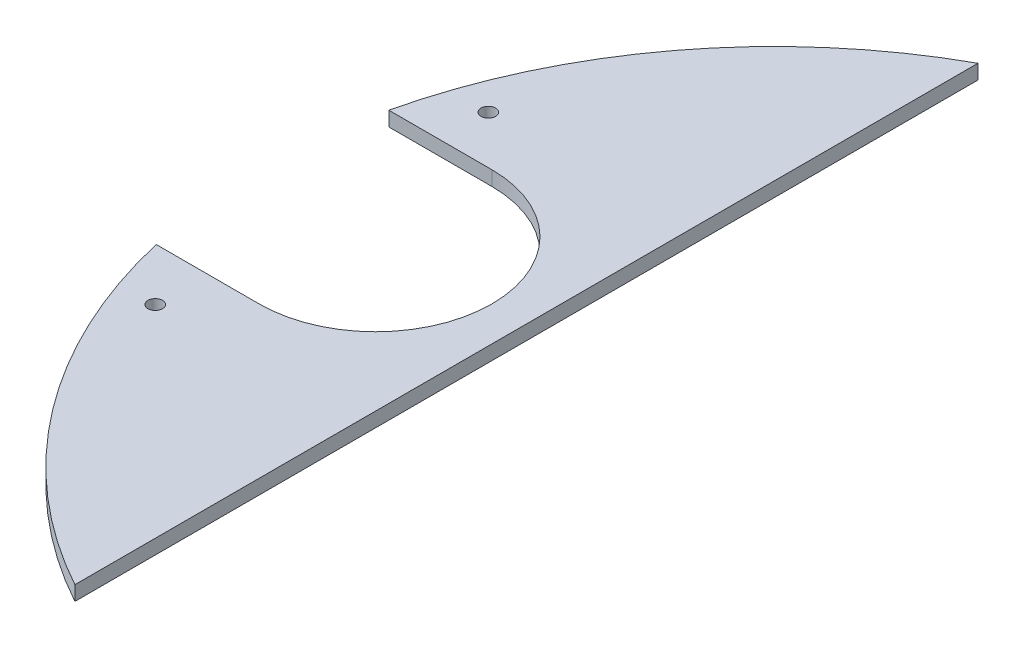
ISO-10303-21;
HEADER;
FILE_DESCRIPTION(('STEP AP214'),'2;1');
FILE_NAME('part.step','',(''),(''),'','','');
FILE_SCHEMA(('AUTOMOTIVE_DESIGN { 1 0 10303 214 1 1 1 1 }'));
ENDSEC;
DATA;
#1=APPLICATION_CONTEXT('core data for automotive mechanical design processes');
#2=APPLICATION_PROTOCOL_DEFINITION('international standard','automotive_design',2000,#1);
#3=PRODUCT_CONTEXT('',#1,'mechanical');
#4=PRODUCT('Part','Part','',(#3));
#5=PRODUCT_RELATED_PRODUCT_CATEGORY('part','',(#4));
#6=PRODUCT_DEFINITION_FORMATION('','',#4);
#7=PRODUCT_DEFINITION_CONTEXT('part definition',#1,'design');
#8=PRODUCT_DEFINITION('design','',#6,#7);
#9=PRODUCT_DEFINITION_SHAPE('','',#8);
#10=(LENGTH_UNIT() NAMED_UNIT(*) SI_UNIT(.MILLI.,.METRE.));
#11=(NAMED_UNIT(*) PLANE_ANGLE_UNIT() SI_UNIT($,.RADIAN.));
#12=(NAMED_UNIT(*) SI_UNIT($,.STERADIAN.) SOLID_ANGLE_UNIT());
#13=UNCERTAINTY_MEASURE_WITH_UNIT(LENGTH_MEASURE(1.E-05),#10,'distance_accuracy_value','');
#14=(GEOMETRIC_REPRESENTATION_CONTEXT(3) GLOBAL_UNCERTAINTY_ASSIGNED_CONTEXT((#13)) GLOBAL_UNIT_ASSIGNED_CONTEXT((#10,
#11,#12)) REPRESENTATION_CONTEXT('',''));
#15=CARTESIAN_POINT('',(0.,0.,0.));
#16=DIRECTION('',(0.,0.,1.));
#17=DIRECTION('',(1.,0.,0.));
#18=AXIS2_PLACEMENT_3D('',#15,#16,#17);
#19=CARTESIAN_POINT('',(-80.,-3.175,0.));
#20=DIRECTION('',(0.,1.,0.));
#21=DIRECTION('',(0.,0.,1.));
#22=AXIS2_PLACEMENT_3D('',#19,#20,#21);
#23=CYLINDRICAL_SURFACE('',#22,112.5);
#24=DIRECTION('',(0.,1.,0.));
#25=VECTOR('',#24,1.);
#26=CARTESIAN_POINT('',(-134.136468804172,-3.175,98.617912903361));
#27=LINE('',#26,#25);
#28=CARTESIAN_POINT('',(-134.136468804172,0.,98.617912903361));
#29=VERTEX_POINT('',#28);
#30=CARTESIAN_POINT('',(-134.136468804172,-3.175,98.617912903361));
#31=VERTEX_POINT('',#30);
#32=EDGE_CURVE('E86',#29,#31,#27,.F.);
#33=ORIENTED_EDGE('',*,*,#32,.F.);
#34=CARTESIAN_POINT('',(-80.,0.,0.));
#35=DIRECTION('',(0.,1.,0.));
#36=DIRECTION('',(0.,0.,1.));
#37=AXIS2_PLACEMENT_3D('',#34,#35,#36);
#38=CIRCLE('',#37,112.5);
#39=CARTESIAN_POINT('',(-189.59511850443,0.,25.4));
#40=VERTEX_POINT('',#39);
#41=EDGE_CURVE('E98',#40,#29,#38,.T.);
#42=ORIENTED_EDGE('',*,*,#41,.F.);
#43=DIRECTION('',(0.,1.,0.));
#44=VECTOR('',#43,1.);
#45=CARTESIAN_POINT('',(-189.59511850443,-3.175,25.4));
#46=LINE('',#45,#44);
#47=CARTESIAN_POINT('',(-189.59511850443,-3.175,25.4));
#48=VERTEX_POINT('',#47);
#49=EDGE_CURVE('E105',#48,#40,#46,.T.);
#50=ORIENTED_EDGE('',*,*,#49,.F.);
#51=CARTESIAN_POINT('',(-80.,-3.175,0.));
#52=DIRECTION('',(0.,1.,0.));
#53=DIRECTION('',(0.,0.,1.));
#54=AXIS2_PLACEMENT_3D('',#51,#52,#53);
#55=CIRCLE('',#54,112.5);
#56=EDGE_CURVE('E100',#48,#31,#55,.T.);
#57=ORIENTED_EDGE('',*,*,#56,.T.);
#58=EDGE_LOOP('',(#33,#42,#50,#57));
#59=FACE_BOUND('',#58,.T.);
#60=ADVANCED_FACE('F33',(#59),#23,.T.);
#61=DIRECTION('',(0.,1.,0.));
#62=VECTOR('',#61,1.);
#63=CARTESIAN_POINT('',(-134.136468804172,-3.175,-98.617912903361));
#64=LINE('',#63,#62);
#65=CARTESIAN_POINT('',(-134.136468804172,-3.175,-98.617912903361));
#66=VERTEX_POINT('',#65);
#67=CARTESIAN_POINT('',(-134.136468804172,0.,-98.617912903361));
#68=VERTEX_POINT('',#67);
#69=EDGE_CURVE('E48',#66,#68,#64,.T.);
#70=ORIENTED_EDGE('',*,*,#69,.F.);
#71=CARTESIAN_POINT('',(-189.59511850443,-3.175,-25.4));
#72=VERTEX_POINT('',#71);
#73=EDGE_CURVE('E41',#66,#72,#55,.T.);
#74=ORIENTED_EDGE('',*,*,#73,.T.);
#75=DIRECTION('',(0.,1.,0.));
#76=VECTOR('',#75,1.);
#77=CARTESIAN_POINT('',(-189.59511850443,-3.175,-25.4));
#78=LINE('',#77,#76);
#79=CARTESIAN_POINT('',(-189.59511850443,0.,-25.4));
#80=VERTEX_POINT('',#79);
#81=EDGE_CURVE('E106',#80,#72,#78,.F.);
#82=ORIENTED_EDGE('',*,*,#81,.F.);
#83=EDGE_CURVE('E104',#68,#80,#38,.T.);
#84=ORIENTED_EDGE('',*,*,#83,.F.);
#85=EDGE_LOOP('',(#70,#74,#82,#84));
#86=FACE_BOUND('',#85,.T.);
#87=ADVANCED_FACE('F35',(#86),#23,.T.);
#88=CARTESIAN_POINT('',(-80.,-3.175,0.));
#89=DIRECTION('',(0.,1.,0.));
#90=DIRECTION('',(0.,0.,1.));
#91=AXIS2_PLACEMENT_3D('',#88,#89,#90);
#92=PLANE('',#91);
#93=CARTESIAN_POINT('',(-178.345859252215,-3.175,-35.8858641471329));
#94=DIRECTION('',(0.,1.,0.));
#95=DIRECTION('',(0.,0.,1.));
#96=AXIS2_PLACEMENT_3D('',#93,#94,#95);
#97=CIRCLE('',#96,1.58749999999999);
#98=CARTESIAN_POINT('',(-178.345859252215,-3.175,-34.2983641471329));
#99=VERTEX_POINT('',#98);
#100=EDGE_CURVE('E134',#99,#99,#97,.T.);
#101=ORIENTED_EDGE('',*,*,#100,.T.);
#102=EDGE_LOOP('',(#101));
#103=FACE_BOUND('',#102,.T.);
#104=CARTESIAN_POINT('',(-178.345859252215,-3.175,36.8647455686073));
#105=DIRECTION('',(0.,1.,0.));
#106=DIRECTION('',(0.,0.,1.));
#107=AXIS2_PLACEMENT_3D('',#104,#105,#106);
#108=CIRCLE('',#107,1.58749999999999);
#109=CARTESIAN_POINT('',(-178.345859252215,-3.175,38.4522455686073));
#110=VERTEX_POINT('',#109);
#111=EDGE_CURVE('E92',#110,#110,#108,.T.);
#112=ORIENTED_EDGE('',*,*,#111,.T.);
#113=EDGE_LOOP('',(#112));
#114=FACE_BOUND('',#113,.T.);
#115=ORIENTED_EDGE('',*,*,#73,.F.);
#116=DIRECTION('',(0.,0.,1.));
#117=VECTOR('',#116,1.);
#118=CARTESIAN_POINT('',(-134.136468804172,-3.175,-167.182890918639));
#119=LINE('',#118,#117);
#120=EDGE_CURVE('E91',#66,#31,#119,.T.);
#121=ORIENTED_EDGE('',*,*,#120,.T.);
#122=ORIENTED_EDGE('',*,*,#56,.F.);
#123=DIRECTION('',(1.,0.,0.));
#124=VECTOR('',#123,1.);
#125=CARTESIAN_POINT('',(-229.776686607569,-3.175,25.4));
#126=LINE('',#125,#124);
#127=CARTESIAN_POINT('',(-167.0966,-3.175,25.4));
#128=VERTEX_POINT('',#127);
#129=EDGE_CURVE('E115',#48,#128,#126,.T.);
#130=ORIENTED_EDGE('',*,*,#129,.T.);
#131=CARTESIAN_POINT('',(-167.0966,-3.175,0.));
#132=DIRECTION('',(0.,1.,0.));
#133=DIRECTION('',(0.,0.,-1.));
#134=AXIS2_PLACEMENT_3D('',#131,#132,#133);
#135=CIRCLE('',#134,25.4);
#136=CARTESIAN_POINT('',(-167.0966,-3.175,-25.4));
#137=VERTEX_POINT('',#136);
#138=EDGE_CURVE('E120',#128,#137,#135,.T.);
#139=ORIENTED_EDGE('',*,*,#138,.T.);
#140=DIRECTION('',(-1.,0.,0.));
#141=VECTOR('',#140,1.);
#142=CARTESIAN_POINT('',(-167.0966,-3.175,-25.4));
#143=LINE('',#142,#141);
#144=EDGE_CURVE('E124',#137,#72,#143,.T.);
#145=ORIENTED_EDGE('',*,*,#144,.T.);
#146=EDGE_LOOP('',(#115,#121,#122,#130,#139,#145));
#147=FACE_BOUND('',#146,.T.);
#148=ADVANCED_FACE('F143',(#103,#114,#147),#92,.F.);
#149=CARTESIAN_POINT('',(-80.,0.,0.));
#150=DIRECTION('',(0.,1.,0.));
#151=DIRECTION('',(0.,0.,1.));
#152=AXIS2_PLACEMENT_3D('',#149,#150,#151);
#153=PLANE('',#152);
#154=CARTESIAN_POINT('',(-178.345859252215,0.,-35.8858641471329));
#155=DIRECTION('',(0.,1.,0.));
#156=DIRECTION('',(0.,0.,1.));
#157=AXIS2_PLACEMENT_3D('',#154,#155,#156);
#158=CIRCLE('',#157,1.58749999999999);
#159=CARTESIAN_POINT('',(-178.345859252215,0.,-34.2983641471329));
#160=VERTEX_POINT('',#159);
#161=EDGE_CURVE('E137',#160,#160,#158,.T.);
#162=ORIENTED_EDGE('',*,*,#161,.F.);
#163=EDGE_LOOP('',(#162));
#164=FACE_BOUND('',#163,.T.);
#165=CARTESIAN_POINT('',(-178.345859252215,0.,36.8647455686073));
#166=DIRECTION('',(0.,1.,0.));
#167=DIRECTION('',(0.,0.,1.));
#168=AXIS2_PLACEMENT_3D('',#165,#166,#167);
#169=CIRCLE('',#168,1.58749999999999);
#170=CARTESIAN_POINT('',(-178.345859252215,0.,38.4522455686073));
#171=VERTEX_POINT('',#170);
#172=EDGE_CURVE('E131',#171,#171,#169,.T.);
#173=ORIENTED_EDGE('',*,*,#172,.F.);
#174=EDGE_LOOP('',(#173));
#175=FACE_BOUND('',#174,.T.);
#176=DIRECTION('',(0.,0.,1.));
#177=VECTOR('',#176,1.);
#178=CARTESIAN_POINT('',(-134.136468804172,0.,-167.182890918639));
#179=LINE('',#178,#177);
#180=EDGE_CURVE('E83',#68,#29,#179,.T.);
#181=ORIENTED_EDGE('',*,*,#180,.F.);
#182=ORIENTED_EDGE('',*,*,#83,.T.);
#183=DIRECTION('',(-1.,0.,0.));
#184=VECTOR('',#183,1.);
#185=CARTESIAN_POINT('',(-167.0966,0.,-25.4));
#186=LINE('',#185,#184);
#187=CARTESIAN_POINT('',(-167.0966,0.,-25.4));
#188=VERTEX_POINT('',#187);
#189=EDGE_CURVE('E117',#188,#80,#186,.T.);
#190=ORIENTED_EDGE('',*,*,#189,.F.);
#191=CARTESIAN_POINT('',(-167.0966,0.,0.));
#192=DIRECTION('',(0.,1.,0.));
#193=DIRECTION('',(0.,0.,-1.));
#194=AXIS2_PLACEMENT_3D('',#191,#192,#193);
#195=CIRCLE('',#194,25.4);
#196=CARTESIAN_POINT('',(-167.0966,0.,25.4));
#197=VERTEX_POINT('',#196);
#198=EDGE_CURVE('E56',#197,#188,#195,.T.);
#199=ORIENTED_EDGE('',*,*,#198,.F.);
#200=DIRECTION('',(1.,0.,0.));
#201=VECTOR('',#200,1.);
#202=CARTESIAN_POINT('',(-80.,0.,25.4));
#203=LINE('',#202,#201);
#204=EDGE_CURVE('E11',#40,#197,#203,.T.);
#205=ORIENTED_EDGE('',*,*,#204,.F.);
#206=ORIENTED_EDGE('',*,*,#41,.T.);
#207=EDGE_LOOP('',(#181,#182,#190,#199,#205,#206));
#208=FACE_BOUND('',#207,.T.);
#209=ADVANCED_FACE('F103',(#164,#175,#208),#153,.T.);
#210=CARTESIAN_POINT('',(-167.0966,-3.175,0.));
#211=DIRECTION('',(0.,1.,0.));
#212=DIRECTION('',(0.,0.,1.));
#213=AXIS2_PLACEMENT_3D('',#210,#211,#212);
#214=CYLINDRICAL_SURFACE('',#213,25.4);
#215=ORIENTED_EDGE('',*,*,#198,.T.);
#216=DIRECTION('',(0.,1.,0.));
#217=VECTOR('',#216,1.);
#218=CARTESIAN_POINT('',(-167.0966,-3.175,-25.4));
#219=LINE('',#218,#217);
#220=EDGE_CURVE('E113',#137,#188,#219,.T.);
#221=ORIENTED_EDGE('',*,*,#220,.F.);
#222=ORIENTED_EDGE('',*,*,#138,.F.);
#223=DIRECTION('',(0.,1.,0.));
#224=VECTOR('',#223,1.);
#225=CARTESIAN_POINT('',(-167.0966,-3.175,25.4));
#226=LINE('',#225,#224);
#227=EDGE_CURVE('E112',#128,#197,#226,.T.);
#228=ORIENTED_EDGE('',*,*,#227,.T.);
#229=EDGE_LOOP('',(#215,#221,#222,#228));
#230=FACE_BOUND('',#229,.T.);
#231=ADVANCED_FACE('F155',(#230),#214,.F.);
#232=CARTESIAN_POINT('',(-229.776686607569,-3.175,25.4));
#233=DIRECTION('',(0.,0.,1.));
#234=DIRECTION('',(1.,0.,0.));
#235=AXIS2_PLACEMENT_3D('',#232,#233,#234);
#236=PLANE('',#235);
#237=ORIENTED_EDGE('',*,*,#49,.T.);
#238=ORIENTED_EDGE('',*,*,#204,.T.);
#239=ORIENTED_EDGE('',*,*,#227,.F.);
#240=ORIENTED_EDGE('',*,*,#129,.F.);
#241=EDGE_LOOP('',(#237,#238,#239,#240));
#242=FACE_BOUND('',#241,.T.);
#243=ADVANCED_FACE('F184',(#242),#236,.F.);
#244=CARTESIAN_POINT('',(-167.0966,-3.175,-25.4));
#245=DIRECTION('',(0.,0.,-1.));
#246=DIRECTION('',(-1.,0.,0.));
#247=AXIS2_PLACEMENT_3D('',#244,#245,#246);
#248=PLANE('',#247);
#249=ORIENTED_EDGE('',*,*,#81,.T.);
#250=ORIENTED_EDGE('',*,*,#144,.F.);
#251=ORIENTED_EDGE('',*,*,#220,.T.);
#252=ORIENTED_EDGE('',*,*,#189,.T.);
#253=EDGE_LOOP('',(#249,#250,#251,#252));
#254=FACE_BOUND('',#253,.T.);
#255=ADVANCED_FACE('F164',(#254),#248,.F.);
#256=CARTESIAN_POINT('',(-134.136468804172,-3.175,-167.182890918639));
#257=DIRECTION('',(-1.,0.,0.));
#258=DIRECTION('',(0.,0.,1.));
#259=AXIS2_PLACEMENT_3D('',#256,#257,#258);
#260=PLANE('',#259);
#261=ORIENTED_EDGE('',*,*,#32,.T.);
#262=ORIENTED_EDGE('',*,*,#120,.F.);
#263=ORIENTED_EDGE('',*,*,#69,.T.);
#264=ORIENTED_EDGE('',*,*,#180,.T.);
#265=EDGE_LOOP('',(#261,#262,#263,#264));
#266=FACE_BOUND('',#265,.T.);
#267=ADVANCED_FACE('F85',(#266),#260,.F.);
#268=CARTESIAN_POINT('',(-178.345859252215,-3.175,36.8647455686073));
#269=DIRECTION('',(0.,1.,0.));
#270=DIRECTION('',(0.,0.,1.));
#271=AXIS2_PLACEMENT_3D('',#268,#269,#270);
#272=CYLINDRICAL_SURFACE('',#271,1.58749999999999);
#273=ORIENTED_EDGE('',*,*,#111,.F.);
#274=EDGE_LOOP('',(#273));
#275=FACE_BOUND('',#274,.T.);
#276=ORIENTED_EDGE('',*,*,#172,.T.);
#277=EDGE_LOOP('',(#276));
#278=FACE_BOUND('',#277,.T.);
#279=ADVANCED_FACE('F149',(#275,#278),#272,.F.);
#280=CARTESIAN_POINT('',(-178.345859252215,-3.175,-35.8858641471329));
#281=DIRECTION('',(0.,1.,0.));
#282=DIRECTION('',(0.,0.,1.));
#283=AXIS2_PLACEMENT_3D('',#280,#281,#282);
#284=CYLINDRICAL_SURFACE('',#283,1.58749999999999);
#285=ORIENTED_EDGE('',*,*,#100,.F.);
#286=EDGE_LOOP('',(#285));
#287=FACE_BOUND('',#286,.T.);
#288=ORIENTED_EDGE('',*,*,#161,.T.);
#289=EDGE_LOOP('',(#288));
#290=FACE_BOUND('',#289,.T.);
#291=ADVANCED_FACE('F146',(#287,#290),#284,.F.);
#292=CLOSED_SHELL('',(#60,#87,#148,#209,#231,#243,#255,#267,#279,#291));
#293=MANIFOLD_SOLID_BREP('B2',#292);
#294=ADVANCED_BREP_SHAPE_REPRESENTATION('',(#18,#293),#14);
#295=SHAPE_DEFINITION_REPRESENTATION(#9,#294);
ENDSEC;
END-ISO-10303-21;
